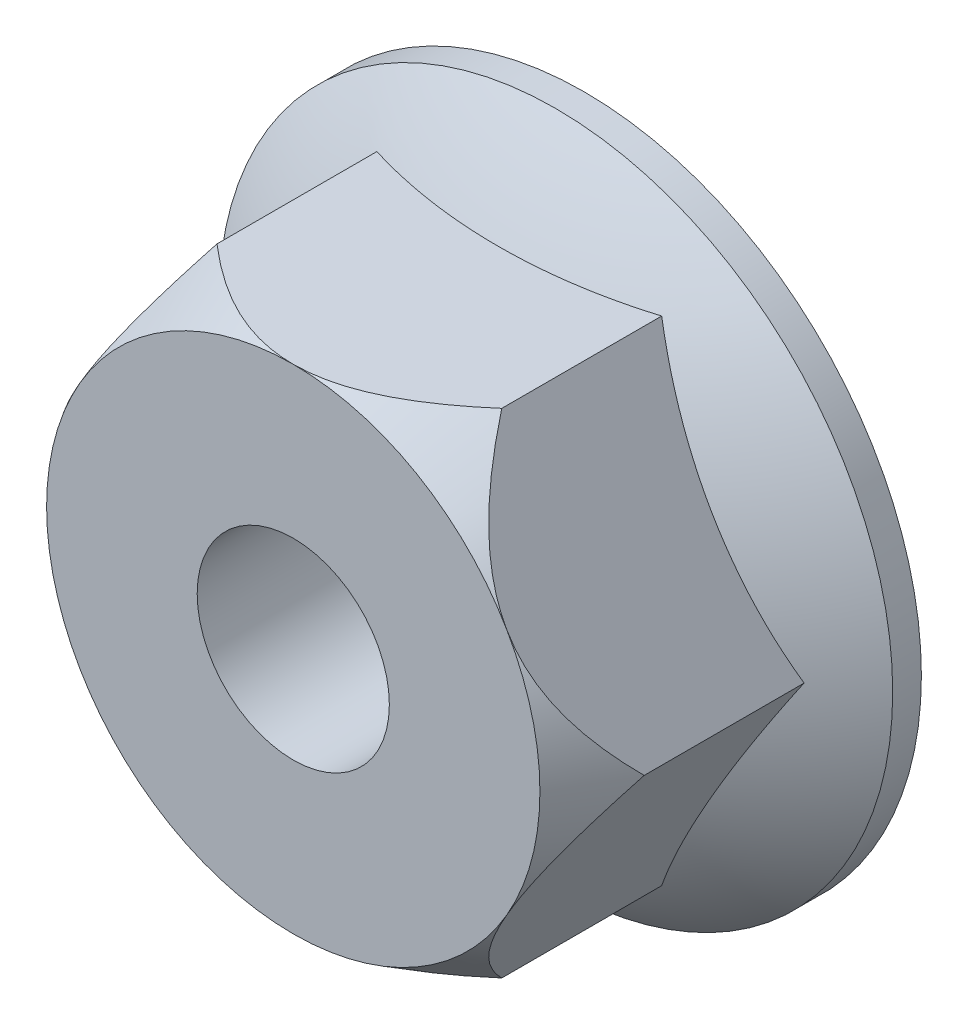
ISO-10303-21;
HEADER;
FILE_DESCRIPTION(('STEP AP214'),'2;1');
FILE_NAME('part.step','',(''),(''),'','','');
FILE_SCHEMA(('AUTOMOTIVE_DESIGN { 1 0 10303 214 1 1 1 1 }'));
ENDSEC;
DATA;
#1=APPLICATION_CONTEXT('core data for automotive mechanical design processes');
#2=APPLICATION_PROTOCOL_DEFINITION('international standard','automotive_design',2000,#1);
#3=PRODUCT_CONTEXT('',#1,'mechanical');
#4=PRODUCT('Part','Part','',(#3));
#5=PRODUCT_RELATED_PRODUCT_CATEGORY('part','',(#4));
#6=PRODUCT_DEFINITION_FORMATION('','',#4);
#7=PRODUCT_DEFINITION_CONTEXT('part definition',#1,'design');
#8=PRODUCT_DEFINITION('design','',#6,#7);
#9=PRODUCT_DEFINITION_SHAPE('','',#8);
#10=(LENGTH_UNIT() NAMED_UNIT(*) SI_UNIT(.MILLI.,.METRE.));
#11=(NAMED_UNIT(*) PLANE_ANGLE_UNIT() SI_UNIT($,.RADIAN.));
#12=(NAMED_UNIT(*) SI_UNIT($,.STERADIAN.) SOLID_ANGLE_UNIT());
#13=UNCERTAINTY_MEASURE_WITH_UNIT(LENGTH_MEASURE(1.E-05),#10,'distance_accuracy_value','');
#14=(GEOMETRIC_REPRESENTATION_CONTEXT(3) GLOBAL_UNCERTAINTY_ASSIGNED_CONTEXT((#13)) GLOBAL_UNIT_ASSIGNED_CONTEXT((#10,
#11,#12)) REPRESENTATION_CONTEXT('',''));
#15=CARTESIAN_POINT('',(0.,0.,0.));
#16=DIRECTION('',(0.,0.,1.));
#17=DIRECTION('',(1.,0.,0.));
#18=AXIS2_PLACEMENT_3D('',#15,#16,#17);
#19=CARTESIAN_POINT('',(2.52232785603564,-4.3688,2.5781));
#20=DIRECTION('',(-0.866025403784439,0.5,0.));
#21=DIRECTION('',(-0.5,-0.866025403784439,0.));
#22=AXIS2_PLACEMENT_3D('',#19,#20,#21);
#23=PLANE('',#22);
#24=DIRECTION('',(0.,0.,-1.));
#25=VECTOR('',#24,1.);
#26=CARTESIAN_POINT('',(5.04465571207128,0.,2.5781));
#27=LINE('',#26,#25);
#28=CARTESIAN_POINT('',(5.04465571207128,0.,1.40748356810692));
#29=VERTEX_POINT('',#28);
#30=CARTESIAN_POINT('',(5.04465571207128,0.,-1.42519994289287));
#31=VERTEX_POINT('',#30);
#32=EDGE_CURVE('E151',#29,#31,#27,.T.);
#33=ORIENTED_EDGE('',*,*,#32,.F.);
#34=CARTESIAN_POINT('',(5.04477118212511,0.000200000000000434,1.40728356124021));
#35=CARTESIAN_POINT('',(5.01838972076335,-0.0454940314564892,1.45297604754845));
#36=CARTESIAN_POINT('',(4.9917450272152,-0.091643994433979,1.49805914697145));
#37=CARTESIAN_POINT('',(4.9378712358627,-0.184956138252875,1.58683669576798));
#38=CARTESIAN_POINT('',(4.91064197353906,-0.232118604050044,1.6305307453956));
#39=CARTESIAN_POINT('',(4.82773264618601,-0.375721771446888,1.75967262761203));
#40=CARTESIAN_POINT('',(4.77109874171729,-0.473814571417709,1.84271089701846));
#41=CARTESIAN_POINT('',(4.65342216765148,-0.677636376560339,2.00232696523342));
#42=CARTESIAN_POINT('',(4.59230339490709,-0.783497196249886,2.07868241350526));
#43=CARTESIAN_POINT('',(4.46675490166529,-1.00095356535839,2.21922394949972));
#44=CARTESIAN_POINT('',(4.40233291331941,-1.11253572229808,2.28343694302576));
#45=CARTESIAN_POINT('',(4.30022820025778,-1.28938627301305,2.37019802539592));
#46=CARTESIAN_POINT('',(4.26374074307293,-1.35258440269621,2.39839695808273));
#47=CARTESIAN_POINT('',(4.18981014820154,-1.48063594924724,2.44932928619382));
#48=CARTESIAN_POINT('',(4.152366939196,-1.54548948964327,2.47206227241787));
#49=CARTESIAN_POINT('',(4.07697163232281,-1.67607799179987,2.51119368264708));
#50=CARTESIAN_POINT('',(4.03902590946211,-1.74180191172453,2.52764082835491));
#51=CARTESIAN_POINT('',(3.96256334543083,-1.8742389575037,2.55385948557379));
#52=CARTESIAN_POINT('',(3.92404661249412,-1.94095189589164,2.56363224608191));
#53=CARTESIAN_POINT('',(3.84636795706199,-2.07549527376372,2.57616954954692));
#54=CARTESIAN_POINT('',(3.80720335993493,-2.14333034584577,2.57886867141013));
#55=CARTESIAN_POINT('',(3.72892021125114,-2.27892073674255,2.57695376960975));
#56=CARTESIAN_POINT('',(3.68980165953607,-2.34667605583157,2.57233977116996));
#57=CARTESIAN_POINT('',(3.61185535922068,-2.48168300823985,2.55597591639989));
#58=CARTESIAN_POINT('',(3.57302842914929,-2.54893322382541,2.54421054632744));
#59=CARTESIAN_POINT('',(3.49602025149047,-2.68231530012878,2.5140088797392));
#60=CARTESIAN_POINT('',(3.45783940716822,-2.7484464623708,2.49556856684735));
#61=CARTESIAN_POINT('',(3.32283408069614,-2.98228254711287,2.41879359988523));
#62=CARTESIAN_POINT('',(3.22836553398302,-3.14590686973719,2.34337101714502));
#63=CARTESIAN_POINT('',(3.09193648217781,-3.38220891909225,2.20940426479207));
#64=CARTESIAN_POINT('',(3.0472273195155,-3.45964746038723,2.16112018073346));
#65=CARTESIAN_POINT('',(2.95945950810159,-3.61166576902525,2.05884869082361));
#66=CARTESIAN_POINT('',(2.91640058938149,-3.68624600396744,2.00486222331745));
#67=CARTESIAN_POINT('',(2.81212553308769,-3.8668556994304,1.86604731677575));
#68=CARTESIAN_POINT('',(2.75179688752463,-3.97134797869744,1.77856845662019));
#69=CARTESIAN_POINT('',(2.66379192808805,-4.12377703975964,1.64238555196898));
#70=CARTESIAN_POINT('',(2.63502740004978,-4.17359866377766,1.59643739233095));
#71=CARTESIAN_POINT('',(2.57814871259972,-4.27211544030899,1.50298003023234));
#72=CARTESIAN_POINT('',(2.550034419995,-4.32081082351923,1.45547115237946));
#73=CARTESIAN_POINT('',(2.5222123859818,-4.369,1.40728356124021));
#74=B_SPLINE_CURVE_WITH_KNOTS('',3,(#34,#35,#36,#37,#38,#39,#40,#41,#42,#43,#44,#45,#46,#47,#48,
#49,#50,#51,#52,#53,#54,#55,#56,#57,#58,#59,#60,#61,#62,#63,#64,#65,#66,#67,#68,#69,#70,#71,#72,
#73),.UNSPECIFIED.,.F.,.F.,(4,2,2,2,2,2,2,2,2,2,2,2,2,2,2,2,2,2,2,4),(0.,0.209383843782731,
0.418827409151647,0.839847625526273,1.27174570653059,1.70267525648481,1.9371989555356,
2.17174020640292,2.40442475702584,2.6370657527735,2.8718508752133,3.10663518785405,
3.34193065388378,3.57736793540426,4.183646853158,4.48841110728903,4.79312528940447,
5.2398120567083,5.46067115270504,5.68148460033933),.UNSPECIFIED.);
#75=CARTESIAN_POINT('',(3.78349178405346,-2.1844,2.5781));
#76=VERTEX_POINT('',#75);
#77=EDGE_CURVE('E132',#29,#76,#74,.T.);
#78=ORIENTED_EDGE('',*,*,#77,.T.);
#79=CARTESIAN_POINT('',(2.52232785603564,-4.3688,1.40748356810692));
#80=VERTEX_POINT('',#79);
#81=EDGE_CURVE('E121',#76,#80,#74,.T.);
#82=ORIENTED_EDGE('',*,*,#81,.T.);
#83=DIRECTION('',(0.,0.,-1.));
#84=VECTOR('',#83,1.);
#85=CARTESIAN_POINT('',(2.52232785603564,-4.3688,2.5781));
#86=LINE('',#85,#84);
#87=CARTESIAN_POINT('',(2.52232785603564,-4.3688,-1.42519994289287));
#88=VERTEX_POINT('',#87);
#89=EDGE_CURVE('E438',#80,#88,#86,.T.);
#90=ORIENTED_EDGE('',*,*,#89,.T.);
#91=CARTESIAN_POINT('',(3.78349178405346,-2.1844,-9.64066349693251));
#92=DIRECTION('',(-0.866025403784439,0.5,0.));
#93=DIRECTION('',(-0.5,-0.866025403784439,0.));
#94=AXIS2_PLACEMENT_3D('',#91,#92,#93);
#95=CIRCLE('',#94,8.59395015235061);
#96=EDGE_CURVE('E453',#31,#88,#95,.F.);
#97=ORIENTED_EDGE('',*,*,#96,.F.);
#98=EDGE_LOOP('',(#33,#78,#82,#90,#97));
#99=FACE_BOUND('',#98,.T.);
#100=ADVANCED_FACE('F49',(#99),#23,.F.);
#101=CARTESIAN_POINT('',(5.04465571207128,0.,2.5781));
#102=DIRECTION('',(-0.866025403784438,-0.5,0.));
#103=DIRECTION('',(0.5,-0.866025403784439,0.));
#104=AXIS2_PLACEMENT_3D('',#101,#102,#103);
#105=PLANE('',#104);
#106=DIRECTION('',(0.,0.,-1.));
#107=VECTOR('',#106,1.);
#108=CARTESIAN_POINT('',(2.52232785603564,4.3688,2.5781));
#109=LINE('',#108,#107);
#110=CARTESIAN_POINT('',(2.52232785603564,4.3688,1.40748356810692));
#111=VERTEX_POINT('',#110);
#112=CARTESIAN_POINT('',(2.52232785603564,4.3688,-1.42519994289287));
#113=VERTEX_POINT('',#112);
#114=EDGE_CURVE('E436',#111,#113,#109,.T.);
#115=ORIENTED_EDGE('',*,*,#114,.F.);
#116=CARTESIAN_POINT('',(2.5222123859818,4.369,1.40728356124021));
#117=CARTESIAN_POINT('',(2.54859384734356,4.32330596854351,1.45297604754845));
#118=CARTESIAN_POINT('',(2.57523854089171,4.27715600556602,1.49805914697145));
#119=CARTESIAN_POINT('',(2.62911233224421,4.18384386174713,1.58683669576798));
#120=CARTESIAN_POINT('',(2.65634159456785,4.13668139594996,1.6305307453956));
#121=CARTESIAN_POINT('',(2.7392509219209,3.99307822855311,1.75967262761203));
#122=CARTESIAN_POINT('',(2.79588482638962,3.89498542858229,1.84271089701846));
#123=CARTESIAN_POINT('',(2.91356140045543,3.69116362343966,2.00232696523342));
#124=CARTESIAN_POINT('',(2.97468017319982,3.58530280375011,2.07868241350526));
#125=CARTESIAN_POINT('',(3.10022866644162,3.36784643464161,2.21922394949972));
#126=CARTESIAN_POINT('',(3.16465065478751,3.25626427770192,2.28343694302576));
#127=CARTESIAN_POINT('',(3.26675536784913,3.07941372698695,2.37019802539592));
#128=CARTESIAN_POINT('',(3.30324282503398,3.01621559730379,2.39839695808273));
#129=CARTESIAN_POINT('',(3.37717341990537,2.88816405075276,2.44932928619382));
#130=CARTESIAN_POINT('',(3.41461662891091,2.82331051035673,2.47206227241787));
#131=CARTESIAN_POINT('',(3.4900119357841,2.69272200820013,2.51119368264708));
#132=CARTESIAN_POINT('',(3.5279576586448,2.62699808827547,2.52764082835491));
#133=CARTESIAN_POINT('',(3.60442022267608,2.49456104249631,2.55385948557379));
#134=CARTESIAN_POINT('',(3.64293695561279,2.42784810410836,2.56363224608191));
#135=CARTESIAN_POINT('',(3.72061561104492,2.29330472623628,2.57616954954692));
#136=CARTESIAN_POINT('',(3.75978020817198,2.22546965415423,2.57886867141013));
#137=CARTESIAN_POINT('',(3.83806335685577,2.08987926325745,2.57695376960975));
#138=CARTESIAN_POINT('',(3.87718190857084,2.02212394416844,2.57233977116996));
#139=CARTESIAN_POINT('',(3.95512820888624,1.88711699176015,2.55597591639989));
#140=CARTESIAN_POINT('',(3.99395513895762,1.81986677617459,2.54421054632744));
#141=CARTESIAN_POINT('',(4.07096331661644,1.68648469987123,2.5140088797392));
#142=CARTESIAN_POINT('',(4.10914416093869,1.6203535376292,2.49556856684735));
#143=CARTESIAN_POINT('',(4.24414948741078,1.38651745288713,2.41879359988523));
#144=CARTESIAN_POINT('',(4.3386180341239,1.22289313026281,2.34337101714502));
#145=CARTESIAN_POINT('',(4.4750470859291,0.986591080907749,2.20940426479207));
#146=CARTESIAN_POINT('',(4.51975624859141,0.909152539612769,2.16112018073346));
#147=CARTESIAN_POINT('',(4.60752406000532,0.757134230974755,2.05884869082361));
#148=CARTESIAN_POINT('',(4.65058297872542,0.682553996032561,2.00486222331745));
#149=CARTESIAN_POINT('',(4.75485803501922,0.501944300569603,1.86604731677575));
#150=CARTESIAN_POINT('',(4.81518668058228,0.397452021302562,1.77856845662019));
#151=CARTESIAN_POINT('',(4.90319164001886,0.245022960240365,1.64238555196898));
#152=CARTESIAN_POINT('',(4.93195616805713,0.195201336222338,1.59643739233095));
#153=CARTESIAN_POINT('',(4.98883485550719,0.0966845596910154,1.50298003023234));
#154=CARTESIAN_POINT('',(5.01694914811192,0.0479891764807695,1.45547115237945));
#155=CARTESIAN_POINT('',(5.04477118212511,-0.000199999999999951,1.40728356124021));
#156=B_SPLINE_CURVE_WITH_KNOTS('',3,(#116,#117,#118,#119,#120,#121,#122,#123,#124,#125,#126,
#127,#128,#129,#130,#131,#132,#133,#134,#135,#136,#137,#138,#139,#140,#141,#142,#143,#144,#145,
#146,#147,#148,#149,#150,#151,#152,#153,#154,#155),.UNSPECIFIED.,.F.,.F.,(4,2,2,2,2,2,2,2,2,2,2,
2,2,2,2,2,2,2,2,4),(0.,0.209383843782731,0.418827409151647,0.839847625526273,1.27174570653059,
1.70267525648481,1.9371989555356,2.17174020640292,2.40442475702584,2.6370657527735,
2.8718508752133,3.10663518785405,3.34193065388378,3.57736793540426,4.183646853158,
4.48841110728903,4.79312528940447,5.2398120567083,5.46067115270504,5.68148460033933),.UNSPECIFIED.);
#157=CARTESIAN_POINT('',(3.78349178405346,2.1844,2.5781));
#158=VERTEX_POINT('',#157);
#159=EDGE_CURVE('E204',#111,#158,#156,.T.);
#160=ORIENTED_EDGE('',*,*,#159,.T.);
#161=EDGE_CURVE('E140',#158,#29,#156,.T.);
#162=ORIENTED_EDGE('',*,*,#161,.T.);
#163=ORIENTED_EDGE('',*,*,#32,.T.);
#164=CARTESIAN_POINT('',(3.78349178405346,2.1844,-9.64066349693251));
#165=DIRECTION('',(-0.866025403784438,-0.5,0.));
#166=DIRECTION('',(0.5,-0.866025403784439,0.));
#167=AXIS2_PLACEMENT_3D('',#164,#165,#166);
#168=CIRCLE('',#167,8.59395015235061);
#169=EDGE_CURVE('E467',#113,#31,#168,.F.);
#170=ORIENTED_EDGE('',*,*,#169,.F.);
#171=EDGE_LOOP('',(#115,#160,#162,#163,#170));
#172=FACE_BOUND('',#171,.T.);
#173=ADVANCED_FACE('F212',(#172),#105,.F.);
#174=CARTESIAN_POINT('',(2.52232785603564,4.3688,2.5781));
#175=DIRECTION('',(0.,-1.,0.));
#176=DIRECTION('',(0.,0.,-1.));
#177=AXIS2_PLACEMENT_3D('',#174,#175,#176);
#178=PLANE('',#177);
#179=DIRECTION('',(0.,0.,-1.));
#180=VECTOR('',#179,1.);
#181=CARTESIAN_POINT('',(-2.52232785603564,4.3688,2.5781));
#182=LINE('',#181,#180);
#183=CARTESIAN_POINT('',(-2.52232785603564,4.3688,1.40748356810692));
#184=VERTEX_POINT('',#183);
#185=CARTESIAN_POINT('',(-2.52232785603564,4.3688,-1.42519994289287));
#186=VERTEX_POINT('',#185);
#187=EDGE_CURVE('E410',#184,#186,#182,.T.);
#188=ORIENTED_EDGE('',*,*,#187,.F.);
#189=CARTESIAN_POINT('',(-6.79494610127638,4.3688,-3.84681115268596));
#190=CARTESIAN_POINT('',(-6.67178960638543,4.3688,-3.66740387224179));
#191=CARTESIAN_POINT('',(-6.54798373573214,4.3688,-3.48843893868895));
#192=CARTESIAN_POINT('',(-6.29881887933844,4.3688,-3.13157737899841));
#193=CARTESIAN_POINT('',(-6.17345979666618,4.3688,-2.9536808205743));
#194=CARTESIAN_POINT('',(-5.92064307765416,4.3688,-2.59873191305055));
#195=CARTESIAN_POINT('',(-5.79318108603631,4.3688,-2.42168266128306));
#196=CARTESIAN_POINT('',(-5.53613555925301,4.3688,-2.06913501388844));
#197=CARTESIAN_POINT('',(-5.40655207154713,4.3688,-1.89363658370306));
#198=CARTESIAN_POINT('',(-5.13654522223353,4.3688,-1.53343844710915));
#199=CARTESIAN_POINT('',(-4.99595625016081,4.3688,-1.34886259881722));
#200=CARTESIAN_POINT('',(-4.71130315156418,4.3688,-0.982411787256466));
#201=CARTESIAN_POINT('',(-4.56723913528422,4.3688,-0.800536738601175));
#202=CARTESIAN_POINT('',(-4.27497315076414,4.3688,-0.440462271994804));
#203=CARTESIAN_POINT('',(-4.12677591482846,4.3688,-0.262259026331427));
#204=CARTESIAN_POINT('',(-3.8250178903273,4.3688,0.0895320518202946));
#205=CARTESIAN_POINT('',(-3.67145787163863,4.3688,0.263120540548997));
#206=CARTESIAN_POINT('',(-3.35950142913357,4.3688,0.601802177022657));
#207=CARTESIAN_POINT('',(-3.20119317156389,4.3688,0.766976129320459));
#208=CARTESIAN_POINT('',(-2.87571765565725,4.3688,1.08888884410601));
#209=CARTESIAN_POINT('',(-2.7085405761754,4.3688,1.24561785084403));
#210=CARTESIAN_POINT('',(-2.45050288771095,4.3688,1.46994762000494));
#211=CARTESIAN_POINT('',(-2.36391173756921,4.3688,1.54245744895338));
#212=CARTESIAN_POINT('',(-2.18759651521151,4.3688,1.68354714058523));
#213=CARTESIAN_POINT('',(-2.09787315540055,4.3688,1.75212788766611));
#214=CARTESIAN_POINT('',(-1.91505055029231,4.3688,1.88428197960861));
#215=CARTESIAN_POINT('',(-1.82195807706779,4.3688,1.94786463435025));
#216=CARTESIAN_POINT('',(-1.63188871345084,4.3688,2.06888447623615));
#217=CARTESIAN_POINT('',(-1.53491387564159,4.3688,2.12632485330402));
#218=CARTESIAN_POINT('',(-1.35974673372052,4.3688,2.22104809994811));
#219=CARTESIAN_POINT('',(-1.28241732713144,4.3688,2.25991562440184));
#220=CARTESIAN_POINT('',(-1.12527510138325,4.3688,2.33222903260985));
#221=CARTESIAN_POINT('',(-1.04546213265367,4.3688,2.36567458907444));
#222=CARTESIAN_POINT('',(-0.802713464736429,4.3688,2.45626559815334));
#223=CARTESIAN_POINT('',(-0.635983157648204,4.3688,2.50393959155582));
#224=CARTESIAN_POINT('',(-0.322642603096501,4.3688,2.56151778337263));
#225=CARTESIAN_POINT('',(-0.176907786628058,4.3688,2.57612242014737));
#226=CARTESIAN_POINT('',(0.114952951380527,4.3688,2.57969714093696));
#227=CARTESIAN_POINT('',(0.261078961305072,4.3688,2.56866083822949));
#228=CARTESIAN_POINT('',(0.54863170191162,4.3688,2.52269528396688));
#229=CARTESIAN_POINT('',(0.690077833005693,4.3688,2.48788251057058));
#230=CARTESIAN_POINT('',(0.966538878207207,4.3688,2.39871043350873));
#231=CARTESIAN_POINT('',(1.10155083800934,4.3688,2.34434224689324));
#232=CARTESIAN_POINT('',(1.35944610394514,4.3688,2.22302562378074));
#233=CARTESIAN_POINT('',(1.48259464616061,4.3688,2.1566276875588));
#234=CARTESIAN_POINT('',(1.72272476024541,4.3688,2.01339122933715));
#235=CARTESIAN_POINT('',(1.83970036089685,4.3688,1.93654284636134));
#236=CARTESIAN_POINT('',(2.0693462054086,4.3688,1.77415227437362));
#237=CARTESIAN_POINT('',(2.18195439573345,4.3688,1.6885232030237));
#238=CARTESIAN_POINT('',(2.34715319692676,4.3688,1.55558264262786));
#239=CARTESIAN_POINT('',(2.40158886445193,4.3688,1.51053014197804));
#240=CARTESIAN_POINT('',(2.50933167578224,4.3688,1.4190960195571));
#241=CARTESIAN_POINT('',(2.56263884066725,4.3688,1.37271442265099));
#242=CARTESIAN_POINT('',(2.72397889117637,4.3688,1.22917889589059));
#243=CARTESIAN_POINT('',(2.83034115104318,4.3688,1.13014442199925));
#244=CARTESIAN_POINT('',(3.03937777185917,4.3688,0.928243810916305));
#245=CARTESIAN_POINT('',(3.1420513703567,4.3688,0.82537689040188));
#246=CARTESIAN_POINT('',(3.34433308543858,4.3688,0.616540693375229));
#247=CARTESIAN_POINT('',(3.44393900602537,4.3688,0.510569295756719));
#248=CARTESIAN_POINT('',(3.64047872859589,4.3688,0.296171930248619));
#249=CARTESIAN_POINT('',(3.73741233456277,4.3688,0.187745783357558));
#250=CARTESIAN_POINT('',(4.025512129414,4.3688,-0.141340152585415));
#251=CARTESIAN_POINT('',(4.21322806223601,4.3688,-0.365020354732293));
#252=CARTESIAN_POINT('',(4.58181743591417,4.3688,-0.817945426324633));
#253=CARTESIAN_POINT('',(4.76268996549047,4.3688,-1.04719103024313));
#254=CARTESIAN_POINT('',(5.10279237884403,4.3688,-1.48850048264436));
#255=CARTESIAN_POINT('',(5.26248455880906,4.3688,-1.70020918641395));
#256=CARTESIAN_POINT('',(5.57839441344209,4.3688,-2.12623479747001));
#257=CARTESIAN_POINT('',(5.73461168197642,4.3688,-2.34055200514596));
#258=CARTESIAN_POINT('',(6.04282993649794,4.3688,-2.76930750327401));
#259=CARTESIAN_POINT('',(6.19485606554616,4.3688,-2.98372776161847));
#260=CARTESIAN_POINT('',(6.49654800001157,4.3688,-3.41415809253691));
#261=CARTESIAN_POINT('',(6.64621428323524,4.3688,-3.63016782994773));
#262=CARTESIAN_POINT('',(6.79494610127639,4.3688,-3.84681115268596));
#263=B_SPLINE_CURVE_WITH_KNOTS('',3,(#189,#190,#191,#192,#193,#194,#195,#196,#197,#198,#199,
#200,#201,#202,#203,#204,#205,#206,#207,#208,#209,#210,#211,#212,#213,#214,#215,#216,#217,#218,
#219,#220,#221,#222,#223,#224,#225,#226,#227,#228,#229,#230,#231,#232,#233,#234,#235,#236,#237,
#238,#239,#240,#241,#242,#243,#244,#245,#246,#247,#248,#249,#250,#251,#252,#253,#254,#255,#256,
#257,#258,#259,#260,#261,#262),.UNSPECIFIED.,.F.,.F.,(4,2,2,2,2,2,2,2,2,2,2,2,2,2,2,2,2,2,2,2,2,
2,2,2,2,2,2,2,2,2,2,2,2,2,2,2,4),(0.,0.652835413369053,1.30571177575939,1.96017288578287,
2.61461937493494,3.310647488194,4.0066535492937,4.70189302889729,5.39703310747974,
6.0831882917098,6.77011984974441,7.10885666393502,7.4475169298126,7.78553064495189,
8.12336795503148,8.38281577666787,8.64227925369119,9.15955081545701,9.59683665378223,
10.0342314242562,10.469498674613,10.9049638931864,11.3240394421813,11.7435132081743,
12.1676341054576,12.3796003603866,12.5915626523918,13.0274166335979,13.4633601940946,
13.8996088947299,14.3358895099448,15.2117078287966,16.0876423656423,16.8831477533991,
17.6787456332281,18.4672670584038,19.2556267237845),.UNSPECIFIED.);
#264=CARTESIAN_POINT('',(0.,4.3688,2.5781));
#265=VERTEX_POINT('',#264);
#266=EDGE_CURVE('E407',#184,#265,#263,.T.);
#267=ORIENTED_EDGE('',*,*,#266,.T.);
#268=EDGE_CURVE('E205',#265,#111,#263,.T.);
#269=ORIENTED_EDGE('',*,*,#268,.T.);
#270=ORIENTED_EDGE('',*,*,#114,.T.);
#271=CARTESIAN_POINT('',(0.,4.3688,-9.64066349693251));
#272=DIRECTION('',(0.,-1.,0.));
#273=DIRECTION('',(0.,0.,-1.));
#274=AXIS2_PLACEMENT_3D('',#271,#272,#273);
#275=CIRCLE('',#274,8.59395015235061);
#276=EDGE_CURVE('E459',#186,#113,#275,.F.);
#277=ORIENTED_EDGE('',*,*,#276,.F.);
#278=EDGE_LOOP('',(#188,#267,#269,#270,#277));
#279=FACE_BOUND('',#278,.T.);
#280=ADVANCED_FACE('F215',(#279),#178,.F.);
#281=CARTESIAN_POINT('',(-2.52232785603564,4.3688,2.5781));
#282=DIRECTION('',(0.866025403784438,-0.5,0.));
#283=DIRECTION('',(0.5,0.866025403784439,0.));
#284=AXIS2_PLACEMENT_3D('',#281,#282,#283);
#285=PLANE('',#284);
#286=DIRECTION('',(0.,0.,-1.));
#287=VECTOR('',#286,1.);
#288=CARTESIAN_POINT('',(-5.04465571207128,0.,2.5781));
#289=LINE('',#288,#287);
#290=CARTESIAN_POINT('',(-5.04465571207128,0.,1.40748356810692));
#291=VERTEX_POINT('',#290);
#292=CARTESIAN_POINT('',(-5.04465571207128,0.,-1.42519994289287));
#293=VERTEX_POINT('',#292);
#294=EDGE_CURVE('E427',#291,#293,#289,.T.);
#295=ORIENTED_EDGE('',*,*,#294,.F.);
#296=CARTESIAN_POINT('',(-5.04477118212511,-0.000199999999998265,1.40728356124021));
#297=CARTESIAN_POINT('',(-5.01838972076335,0.0454940314564914,1.45297604754845));
#298=CARTESIAN_POINT('',(-4.99174502721521,0.0916439944339811,1.49805914697145));
#299=CARTESIAN_POINT('',(-4.9378712358627,0.184956138252877,1.58683669576798));
#300=CARTESIAN_POINT('',(-4.91064197353906,0.232118604050046,1.6305307453956));
#301=CARTESIAN_POINT('',(-4.82773264618601,0.37572177144689,1.75967262761203));
#302=CARTESIAN_POINT('',(-4.77109874171729,0.473814571417712,1.84271089701846));
#303=CARTESIAN_POINT('',(-4.65342216765148,0.677636376560341,2.00232696523342));
#304=CARTESIAN_POINT('',(-4.59230339490709,0.783497196249888,2.07868241350526));
#305=CARTESIAN_POINT('',(-4.46675490166529,1.00095356535839,2.21922394949972));
#306=CARTESIAN_POINT('',(-4.40233291331941,1.11253572229808,2.28343694302576));
#307=CARTESIAN_POINT('',(-4.30022820025779,1.28938627301305,2.37019802539592));
#308=CARTESIAN_POINT('',(-4.26374074307293,1.35258440269621,2.39839695808273));
#309=CARTESIAN_POINT('',(-4.18981014820154,1.48063594924725,2.44932928619381));
#310=CARTESIAN_POINT('',(-4.152366939196,1.54548948964327,2.47206227241787));
#311=CARTESIAN_POINT('',(-4.07697163232281,1.67607799179988,2.51119368264708));
#312=CARTESIAN_POINT('',(-4.03902590946211,1.74180191172453,2.52764082835491));
#313=CARTESIAN_POINT('',(-3.96256334543083,1.8742389575037,2.55385948557378));
#314=CARTESIAN_POINT('',(-3.92404661249412,1.94095189589164,2.56363224608191));
#315=CARTESIAN_POINT('',(-3.84636795706199,2.07549527376373,2.57616954954692));
#316=CARTESIAN_POINT('',(-3.80720335993493,2.14333034584577,2.57886867141012));
#317=CARTESIAN_POINT('',(-3.72892021125114,2.27892073674256,2.57695376960974));
#318=CARTESIAN_POINT('',(-3.68980165953607,2.34667605583157,2.57233977116995));
#319=CARTESIAN_POINT('',(-3.61185535922068,2.48168300823986,2.55597591639989));
#320=CARTESIAN_POINT('',(-3.57302842914929,2.54893322382541,2.54421054632744));
#321=CARTESIAN_POINT('',(-3.49602025149047,2.68231530012878,2.5140088797392));
#322=CARTESIAN_POINT('',(-3.45783940716822,2.7484464623708,2.49556856684735));
#323=CARTESIAN_POINT('',(-3.32283408069614,2.98228254711287,2.41879359988523));
#324=CARTESIAN_POINT('',(-3.22836553398302,3.14590686973719,2.34337101714502));
#325=CARTESIAN_POINT('',(-3.09193648217781,3.38220891909226,2.20940426479207));
#326=CARTESIAN_POINT('',(-3.0472273195155,3.45964746038724,2.16112018073346));
#327=CARTESIAN_POINT('',(-2.95945950810159,3.61166576902525,2.05884869082361));
#328=CARTESIAN_POINT('',(-2.91640058938149,3.68624600396744,2.00486222331745));
#329=CARTESIAN_POINT('',(-2.81212553308769,3.8668556994304,1.86604731677575));
#330=CARTESIAN_POINT('',(-2.75179688752463,3.97134797869744,1.77856845662019));
#331=CARTESIAN_POINT('',(-2.66379192808805,4.12377703975964,1.64238555196897));
#332=CARTESIAN_POINT('',(-2.63502740004978,4.17359866377766,1.59643739233095));
#333=CARTESIAN_POINT('',(-2.57814871259973,4.27211544030899,1.50298003023234));
#334=CARTESIAN_POINT('',(-2.550034419995,4.32081082351923,1.45547115237945));
#335=CARTESIAN_POINT('',(-2.5222123859818,4.369,1.40728356124021));
#336=B_SPLINE_CURVE_WITH_KNOTS('',3,(#296,#297,#298,#299,#300,#301,#302,#303,#304,#305,#306,
#307,#308,#309,#310,#311,#312,#313,#314,#315,#316,#317,#318,#319,#320,#321,#322,#323,#324,#325,
#326,#327,#328,#329,#330,#331,#332,#333,#334,#335),.UNSPECIFIED.,.F.,.F.,(4,2,2,2,2,2,2,2,2,2,2,
2,2,2,2,2,2,2,2,4),(0.,0.209383843782731,0.418827409151647,0.839847625526273,1.27174570653059,
1.70267525648481,1.9371989555356,2.17174020640292,2.40442475702584,2.6370657527735,
2.8718508752133,3.10663518785405,3.34193065388379,3.57736793540426,4.183646853158,
4.48841110728904,4.79312528940447,5.2398120567083,5.46067115270504,5.68148460033932),.UNSPECIFIED.);
#337=CARTESIAN_POINT('',(-3.78349178405346,2.1844,2.5781));
#338=VERTEX_POINT('',#337);
#339=EDGE_CURVE('E155',#291,#338,#336,.T.);
#340=ORIENTED_EDGE('',*,*,#339,.T.);
#341=EDGE_CURVE('E419',#338,#184,#336,.T.);
#342=ORIENTED_EDGE('',*,*,#341,.T.);
#343=ORIENTED_EDGE('',*,*,#187,.T.);
#344=CARTESIAN_POINT('',(-3.78349178405346,2.1844,-9.64066349693251));
#345=DIRECTION('',(0.866025403784438,-0.5,0.));
#346=DIRECTION('',(0.5,0.866025403784439,0.));
#347=AXIS2_PLACEMENT_3D('',#344,#345,#346);
#348=CIRCLE('',#347,8.59395015235061);
#349=EDGE_CURVE('E429',#293,#186,#348,.F.);
#350=ORIENTED_EDGE('',*,*,#349,.F.);
#351=EDGE_LOOP('',(#295,#340,#342,#343,#350));
#352=FACE_BOUND('',#351,.T.);
#353=ADVANCED_FACE('F219',(#352),#285,.F.);
#354=CARTESIAN_POINT('',(-5.04465571207128,0.,2.5781));
#355=DIRECTION('',(0.866025403784439,0.5,0.));
#356=DIRECTION('',(-0.5,0.866025403784439,0.));
#357=AXIS2_PLACEMENT_3D('',#354,#355,#356);
#358=PLANE('',#357);
#359=DIRECTION('',(0.,0.,-1.));
#360=VECTOR('',#359,1.);
#361=CARTESIAN_POINT('',(-2.52232785603564,-4.3688,2.5781));
#362=LINE('',#361,#360);
#363=CARTESIAN_POINT('',(-2.52232785603564,-4.3688,1.40748356810693));
#364=VERTEX_POINT('',#363);
#365=CARTESIAN_POINT('',(-2.52232785603564,-4.3688,-1.42519994289287));
#366=VERTEX_POINT('',#365);
#367=EDGE_CURVE('E396',#364,#366,#362,.T.);
#368=ORIENTED_EDGE('',*,*,#367,.F.);
#369=CARTESIAN_POINT('',(-2.5222123859818,-4.369,1.40728356124021));
#370=CARTESIAN_POINT('',(-2.54859384734356,-4.32330596854351,1.45297604754845));
#371=CARTESIAN_POINT('',(-2.57523854089171,-4.27715600556602,1.49805914697145));
#372=CARTESIAN_POINT('',(-2.62911233224421,-4.18384386174713,1.58683669576798));
#373=CARTESIAN_POINT('',(-2.65634159456785,-4.13668139594996,1.6305307453956));
#374=CARTESIAN_POINT('',(-2.7392509219209,-3.99307822855311,1.75967262761203));
#375=CARTESIAN_POINT('',(-2.79588482638962,-3.89498542858229,1.84271089701846));
#376=CARTESIAN_POINT('',(-2.91356140045543,-3.69116362343966,2.00232696523342));
#377=CARTESIAN_POINT('',(-2.97468017319983,-3.58530280375011,2.07868241350526));
#378=CARTESIAN_POINT('',(-3.10022866644162,-3.36784643464161,2.21922394949972));
#379=CARTESIAN_POINT('',(-3.16465065478751,-3.25626427770192,2.28343694302576));
#380=CARTESIAN_POINT('',(-3.26675536784913,-3.07941372698695,2.37019802539592));
#381=CARTESIAN_POINT('',(-3.30324282503398,-3.01621559730379,2.39839695808273));
#382=CARTESIAN_POINT('',(-3.37717341990537,-2.88816405075276,2.44932928619382));
#383=CARTESIAN_POINT('',(-3.41461662891092,-2.82331051035673,2.47206227241787));
#384=CARTESIAN_POINT('',(-3.4900119357841,-2.69272200820013,2.51119368264708));
#385=CARTESIAN_POINT('',(-3.5279576586448,-2.62699808827547,2.52764082835491));
#386=CARTESIAN_POINT('',(-3.60442022267608,-2.4945610424963,2.55385948557379));
#387=CARTESIAN_POINT('',(-3.64293695561279,-2.42784810410836,2.56363224608191));
#388=CARTESIAN_POINT('',(-3.72061561104492,-2.29330472623628,2.57616954954692));
#389=CARTESIAN_POINT('',(-3.75978020817199,-2.22546965415423,2.57886867141013));
#390=CARTESIAN_POINT('',(-3.83806335685577,-2.08987926325745,2.57695376960975));
#391=CARTESIAN_POINT('',(-3.87718190857084,-2.02212394416843,2.57233977116996));
#392=CARTESIAN_POINT('',(-3.95512820888624,-1.88711699176015,2.55597591639989));
#393=CARTESIAN_POINT('',(-3.99395513895762,-1.81986677617459,2.54421054632744));
#394=CARTESIAN_POINT('',(-4.07096331661644,-1.68648469987122,2.5140088797392));
#395=CARTESIAN_POINT('',(-4.10914416093869,-1.6203535376292,2.49556856684735));
#396=CARTESIAN_POINT('',(-4.24414948741078,-1.38651745288713,2.41879359988523));
#397=CARTESIAN_POINT('',(-4.3386180341239,-1.22289313026281,2.34337101714502));
#398=CARTESIAN_POINT('',(-4.4750470859291,-0.986591080907746,2.20940426479207));
#399=CARTESIAN_POINT('',(-4.51975624859141,-0.909152539612766,2.16112018073346));
#400=CARTESIAN_POINT('',(-4.60752406000532,-0.757134230974753,2.05884869082361));
#401=CARTESIAN_POINT('',(-4.65058297872542,-0.682553996032559,2.00486222331745));
#402=CARTESIAN_POINT('',(-4.75485803501922,-0.5019443005696,1.86604731677575));
#403=CARTESIAN_POINT('',(-4.81518668058228,-0.397452021302559,1.77856845662019));
#404=CARTESIAN_POINT('',(-4.90319164001886,-0.245022960240362,1.64238555196898));
#405=CARTESIAN_POINT('',(-4.93195616805713,-0.195201336222336,1.59643739233095));
#406=CARTESIAN_POINT('',(-4.98883485550719,-0.0966845596910135,1.50298003023234));
#407=CARTESIAN_POINT('',(-5.01694914811192,-0.0479891764807678,1.45547115237945));
#408=CARTESIAN_POINT('',(-5.04477118212511,0.000200000000001716,1.40728356124021));
#409=B_SPLINE_CURVE_WITH_KNOTS('',3,(#369,#370,#371,#372,#373,#374,#375,#376,#377,#378,#379,
#380,#381,#382,#383,#384,#385,#386,#387,#388,#389,#390,#391,#392,#393,#394,#395,#396,#397,#398,
#399,#400,#401,#402,#403,#404,#405,#406,#407,#408),.UNSPECIFIED.,.F.,.F.,(4,2,2,2,2,2,2,2,2,2,2,
2,2,2,2,2,2,2,2,4),(0.,0.209383843782731,0.418827409151647,0.839847625526273,1.27174570653059,
1.70267525648481,1.9371989555356,2.17174020640292,2.40442475702584,2.6370657527735,
2.8718508752133,3.10663518785405,3.34193065388379,3.57736793540426,4.183646853158,
4.48841110728904,4.79312528940447,5.2398120567083,5.46067115270505,5.68148460033933),.UNSPECIFIED.);
#410=CARTESIAN_POINT('',(-3.78349178405346,-2.1844,2.5781));
#411=VERTEX_POINT('',#410);
#412=EDGE_CURVE('E133',#364,#411,#409,.T.);
#413=ORIENTED_EDGE('',*,*,#412,.T.);
#414=EDGE_CURVE('E73',#411,#291,#409,.T.);
#415=ORIENTED_EDGE('',*,*,#414,.T.);
#416=ORIENTED_EDGE('',*,*,#294,.T.);
#417=CARTESIAN_POINT('',(-3.78349178405346,-2.1844,-9.64066349693251));
#418=DIRECTION('',(0.866025403784439,0.5,0.));
#419=DIRECTION('',(-0.5,0.866025403784439,0.));
#420=AXIS2_PLACEMENT_3D('',#417,#418,#419);
#421=CIRCLE('',#420,8.59395015235061);
#422=EDGE_CURVE('E452',#366,#293,#421,.F.);
#423=ORIENTED_EDGE('',*,*,#422,.F.);
#424=EDGE_LOOP('',(#368,#413,#415,#416,#423));
#425=FACE_BOUND('',#424,.T.);
#426=ADVANCED_FACE('F223',(#425),#358,.F.);
#427=CARTESIAN_POINT('',(-2.52232785603564,-4.3688,2.5781));
#428=DIRECTION('',(0.,1.,0.));
#429=DIRECTION('',(-1.,0.,0.));
#430=AXIS2_PLACEMENT_3D('',#427,#428,#429);
#431=PLANE('',#430);
#432=ORIENTED_EDGE('',*,*,#89,.F.);
#433=CARTESIAN_POINT('',(6.79494610127638,-4.3688,-3.84681115268596));
#434=CARTESIAN_POINT('',(6.67178960638543,-4.3688,-3.66740387224179));
#435=CARTESIAN_POINT('',(6.54798373573214,-4.3688,-3.48843893868895));
#436=CARTESIAN_POINT('',(6.29881887933844,-4.3688,-3.13157737899841));
#437=CARTESIAN_POINT('',(6.17345979666618,-4.3688,-2.9536808205743));
#438=CARTESIAN_POINT('',(5.92064307765416,-4.3688,-2.59873191305055));
#439=CARTESIAN_POINT('',(5.79318108603631,-4.3688,-2.42168266128306));
#440=CARTESIAN_POINT('',(5.53613555925301,-4.3688,-2.06913501388844));
#441=CARTESIAN_POINT('',(5.40655207154713,-4.3688,-1.89363658370306));
#442=CARTESIAN_POINT('',(5.13654522223353,-4.3688,-1.53343844710915));
#443=CARTESIAN_POINT('',(4.99595625016081,-4.3688,-1.34886259881722));
#444=CARTESIAN_POINT('',(4.71130315156418,-4.3688,-0.982411787256466));
#445=CARTESIAN_POINT('',(4.56723913528422,-4.3688,-0.800536738601175));
#446=CARTESIAN_POINT('',(4.27497315076414,-4.3688,-0.440462271994804));
#447=CARTESIAN_POINT('',(4.12677591482846,-4.3688,-0.262259026331427));
#448=CARTESIAN_POINT('',(3.8250178903273,-4.3688,0.0895320518202944));
#449=CARTESIAN_POINT('',(3.67145787163863,-4.3688,0.263120540548997));
#450=CARTESIAN_POINT('',(3.35950142913358,-4.3688,0.601802177022656));
#451=CARTESIAN_POINT('',(3.20119317156389,-4.3688,0.766976129320458));
#452=CARTESIAN_POINT('',(2.87571765565725,-4.3688,1.08888884410601));
#453=CARTESIAN_POINT('',(2.7085405761754,-4.3688,1.24561785084403));
#454=CARTESIAN_POINT('',(2.45050288771095,-4.3688,1.46994762000494));
#455=CARTESIAN_POINT('',(2.36391173756921,-4.3688,1.54245744895338));
#456=CARTESIAN_POINT('',(2.18759651521151,-4.3688,1.68354714058523));
#457=CARTESIAN_POINT('',(2.09787315540055,-4.3688,1.75212788766611));
#458=CARTESIAN_POINT('',(1.91505055029231,-4.3688,1.88428197960861));
#459=CARTESIAN_POINT('',(1.82195807706779,-4.3688,1.94786463435025));
#460=CARTESIAN_POINT('',(1.63188871345084,-4.3688,2.06888447623615));
#461=CARTESIAN_POINT('',(1.5349138756416,-4.3688,2.12632485330402));
#462=CARTESIAN_POINT('',(1.35974673372053,-4.3688,2.22104809994811));
#463=CARTESIAN_POINT('',(1.28241732713144,-4.3688,2.25991562440184));
#464=CARTESIAN_POINT('',(1.12527510138325,-4.3688,2.33222903260985));
#465=CARTESIAN_POINT('',(1.04546213265367,-4.3688,2.36567458907444));
#466=CARTESIAN_POINT('',(0.80271346473643,-4.3688,2.45626559815334));
#467=CARTESIAN_POINT('',(0.635983157648205,-4.3688,2.50393959155582));
#468=CARTESIAN_POINT('',(0.322642603096503,-4.3688,2.56151778337263));
#469=CARTESIAN_POINT('',(0.176907786628059,-4.3688,2.57612242014737));
#470=CARTESIAN_POINT('',(-0.114952951380525,-4.3688,2.57969714093696));
#471=CARTESIAN_POINT('',(-0.26107896130507,-4.3688,2.56866083822949));
#472=CARTESIAN_POINT('',(-0.548631701911619,-4.3688,2.52269528396688));
#473=CARTESIAN_POINT('',(-0.690077833005691,-4.3688,2.48788251057058));
#474=CARTESIAN_POINT('',(-0.966538878207206,-4.3688,2.39871043350873));
#475=CARTESIAN_POINT('',(-1.10155083800933,-4.3688,2.34434224689324));
#476=CARTESIAN_POINT('',(-1.35944610394513,-4.3688,2.22302562378074));
#477=CARTESIAN_POINT('',(-1.48259464616061,-4.3688,2.1566276875588));
#478=CARTESIAN_POINT('',(-1.72272476024541,-4.3688,2.01339122933715));
#479=CARTESIAN_POINT('',(-1.83970036089685,-4.3688,1.93654284636134));
#480=CARTESIAN_POINT('',(-2.0693462054086,-4.3688,1.77415227437362));
#481=CARTESIAN_POINT('',(-2.18195439573345,-4.3688,1.6885232030237));
#482=CARTESIAN_POINT('',(-2.34715319692675,-4.3688,1.55558264262787));
#483=CARTESIAN_POINT('',(-2.40158886445193,-4.3688,1.51053014197805));
#484=CARTESIAN_POINT('',(-2.50933167578224,-4.3688,1.4190960195571));
#485=CARTESIAN_POINT('',(-2.56263884066724,-4.3688,1.37271442265099));
#486=CARTESIAN_POINT('',(-2.72397889117637,-4.3688,1.2291788958906));
#487=CARTESIAN_POINT('',(-2.83034115104317,-4.3688,1.13014442199926));
#488=CARTESIAN_POINT('',(-3.03937777185916,-4.3688,0.92824381091631));
#489=CARTESIAN_POINT('',(-3.14205137035669,-4.3688,0.825376890401884));
#490=CARTESIAN_POINT('',(-3.34433308543858,-4.3688,0.616540693375233));
#491=CARTESIAN_POINT('',(-3.44393900602537,-4.3688,0.510569295756724));
#492=CARTESIAN_POINT('',(-3.64047872859589,-4.3688,0.296171930248624));
#493=CARTESIAN_POINT('',(-3.73741233456277,-4.3688,0.187745783357562));
#494=CARTESIAN_POINT('',(-4.025512129414,-4.3688,-0.141340152585412));
#495=CARTESIAN_POINT('',(-4.21322806223601,-4.3688,-0.365020354732291));
#496=CARTESIAN_POINT('',(-4.58181743591417,-4.3688,-0.817945426324631));
#497=CARTESIAN_POINT('',(-4.76268996549047,-4.3688,-1.04719103024313));
#498=CARTESIAN_POINT('',(-5.10279237884403,-4.3688,-1.48850048264435));
#499=CARTESIAN_POINT('',(-5.26248455880906,-4.3688,-1.70020918641395));
#500=CARTESIAN_POINT('',(-5.57839441344209,-4.3688,-2.12623479747001));
#501=CARTESIAN_POINT('',(-5.73461168197642,-4.3688,-2.34055200514596));
#502=CARTESIAN_POINT('',(-6.04282993649794,-4.3688,-2.76930750327401));
#503=CARTESIAN_POINT('',(-6.19485606554616,-4.3688,-2.98372776161847));
#504=CARTESIAN_POINT('',(-6.49654800001157,-4.3688,-3.41415809253691));
#505=CARTESIAN_POINT('',(-6.64621428323524,-4.3688,-3.63016782994773));
#506=CARTESIAN_POINT('',(-6.79494610127639,-4.3688,-3.84681115268596));
#507=B_SPLINE_CURVE_WITH_KNOTS('',3,(#433,#434,#435,#436,#437,#438,#439,#440,#441,#442,#443,
#444,#445,#446,#447,#448,#449,#450,#451,#452,#453,#454,#455,#456,#457,#458,#459,#460,#461,#462,
#463,#464,#465,#466,#467,#468,#469,#470,#471,#472,#473,#474,#475,#476,#477,#478,#479,#480,#481,
#482,#483,#484,#485,#486,#487,#488,#489,#490,#491,#492,#493,#494,#495,#496,#497,#498,#499,#500,
#501,#502,#503,#504,#505,#506),.UNSPECIFIED.,.F.,.F.,(4,2,2,2,2,2,2,2,2,2,2,2,2,2,2,2,2,2,2,2,2,
2,2,2,2,2,2,2,2,2,2,2,2,2,2,2,4),(0.,0.652835413369054,1.30571177575939,1.96017288578287,
2.61461937493494,3.310647488194,4.0066535492937,4.70189302889729,5.39703310747974,
6.0831882917098,6.77011984974441,7.10885666393502,7.4475169298126,7.78553064495189,
8.12336795503148,8.38281577666786,8.64227925369119,9.15955081545701,9.59683665378223,
10.0342314242562,10.469498674613,10.9049638931864,11.3240394421813,11.7435132081743,
12.1676341054576,12.3796003603866,12.5915626523918,13.0274166335979,13.4633601940946,
13.8996088947299,14.3358895099448,15.2117078287966,16.0876423656423,16.8831477533991,
17.6787456332281,18.4672670584038,19.2556267237845),.UNSPECIFIED.);
#508=CARTESIAN_POINT('',(0.,-4.3688,2.5781));
#509=VERTEX_POINT('',#508);
#510=EDGE_CURVE('E127',#80,#509,#507,.T.);
#511=ORIENTED_EDGE('',*,*,#510,.T.);
#512=EDGE_CURVE('E66',#509,#364,#507,.T.);
#513=ORIENTED_EDGE('',*,*,#512,.T.);
#514=ORIENTED_EDGE('',*,*,#367,.T.);
#515=CARTESIAN_POINT('',(0.,-4.3688,-9.64066349693251));
#516=DIRECTION('',(0.,1.,0.));
#517=DIRECTION('',(-1.,0.,0.));
#518=AXIS2_PLACEMENT_3D('',#515,#516,#517);
#519=CIRCLE('',#518,8.59395015235061);
#520=EDGE_CURVE('E146',#88,#366,#519,.F.);
#521=ORIENTED_EDGE('',*,*,#520,.F.);
#522=EDGE_LOOP('',(#432,#511,#513,#514,#521));
#523=FACE_BOUND('',#522,.T.);
#524=ADVANCED_FACE('F227',(#523),#431,.F.);
#525=CARTESIAN_POINT('',(0.,0.,-9.64066349693251));
#526=DIRECTION('',(0.,0.,1.));
#527=DIRECTION('',(-1.,0.,0.));
#528=AXIS2_PLACEMENT_3D('',#525,#526,#527);
#529=SPHERICAL_SURFACE('',#528,9.64066349693251);
#530=CARTESIAN_POINT('',(0.,0.,-2.0701));
#531=DIRECTION('',(0.,0.,1.));
#532=DIRECTION('',(1.,0.,0.));
#533=AXIS2_PLACEMENT_3D('',#530,#531,#532);
#534=CIRCLE('',#533,5.969);
#535=CARTESIAN_POINT('',(5.969,0.,-2.0701));
#536=VERTEX_POINT('',#535);
#537=EDGE_CURVE('E413',#536,#536,#534,.T.);
#538=ORIENTED_EDGE('',*,*,#537,.T.);
#539=EDGE_LOOP('',(#538));
#540=FACE_BOUND('',#539,.T.);
#541=ORIENTED_EDGE('',*,*,#169,.T.);
#542=ORIENTED_EDGE('',*,*,#96,.T.);
#543=ORIENTED_EDGE('',*,*,#520,.T.);
#544=ORIENTED_EDGE('',*,*,#422,.T.);
#545=ORIENTED_EDGE('',*,*,#349,.T.);
#546=ORIENTED_EDGE('',*,*,#276,.T.);
#547=EDGE_LOOP('',(#541,#542,#543,#544,#545,#546));
#548=FACE_BOUND('',#547,.T.);
#549=ADVANCED_FACE('F185',(#540,#548),#529,.T.);
#550=CARTESIAN_POINT('',(0.,0.,0.));
#551=DIRECTION('',(0.,0.,1.));
#552=DIRECTION('',(1.,0.,0.));
#553=AXIS2_PLACEMENT_3D('',#550,#551,#552);
#554=CYLINDRICAL_SURFACE('',#553,5.969);
#555=ORIENTED_EDGE('',*,*,#537,.F.);
#556=EDGE_LOOP('',(#555));
#557=FACE_BOUND('',#556,.T.);
#558=CARTESIAN_POINT('',(0.,0.,-2.5781));
#559=DIRECTION('',(0.,0.,1.));
#560=DIRECTION('',(1.,0.,0.));
#561=AXIS2_PLACEMENT_3D('',#558,#559,#560);
#562=CIRCLE('',#561,5.969);
#563=CARTESIAN_POINT('',(5.969,0.,-2.5781));
#564=VERTEX_POINT('',#563);
#565=EDGE_CURVE('E418',#564,#564,#562,.T.);
#566=ORIENTED_EDGE('',*,*,#565,.T.);
#567=EDGE_LOOP('',(#566));
#568=FACE_BOUND('',#567,.T.);
#569=ADVANCED_FACE('F236',(#557,#568),#554,.T.);
#570=CARTESIAN_POINT('',(0.,0.,-2.5781));
#571=DIRECTION('',(0.,0.,1.));
#572=DIRECTION('',(1.,0.,0.));
#573=AXIS2_PLACEMENT_3D('',#570,#571,#572);
#574=PLANE('',#573);
#575=CARTESIAN_POINT('',(0.,0.,-2.5781));
#576=DIRECTION('',(0.,0.,-1.));
#577=DIRECTION('',(-1.,0.,0.));
#578=AXIS2_PLACEMENT_3D('',#575,#576,#577);
#579=CIRCLE('',#578,1.7018);
#580=CARTESIAN_POINT('',(-1.7018,0.,-2.5781));
#581=VERTEX_POINT('',#580);
#582=EDGE_CURVE('E374',#581,#581,#579,.T.);
#583=ORIENTED_EDGE('',*,*,#582,.F.);
#584=EDGE_LOOP('',(#583));
#585=FACE_BOUND('',#584,.T.);
#586=ORIENTED_EDGE('',*,*,#565,.F.);
#587=EDGE_LOOP('',(#586));
#588=FACE_BOUND('',#587,.T.);
#589=ADVANCED_FACE('F233',(#585,#588),#574,.F.);
#590=CARTESIAN_POINT('',(0.,0.,2.5781));
#591=DIRECTION('',(0.,0.,-1.));
#592=DIRECTION('',(-1.,0.,0.));
#593=AXIS2_PLACEMENT_3D('',#590,#591,#592);
#594=CONICAL_SURFACE('',#593,4.3688,0.523598775598304);
#595=CARTESIAN_POINT('',(0.,0.,2.5781));
#596=DIRECTION('',(0.,0.,1.));
#597=DIRECTION('',(1.,0.,0.));
#598=AXIS2_PLACEMENT_3D('',#595,#596,#597);
#599=CIRCLE('',#598,4.3688);
#600=EDGE_CURVE('E53',#158,#76,#599,.F.);
#601=ORIENTED_EDGE('',*,*,#600,.T.);
#602=ORIENTED_EDGE('',*,*,#77,.F.);
#603=ORIENTED_EDGE('',*,*,#161,.F.);
#604=EDGE_LOOP('',(#601,#602,#603));
#605=FACE_BOUND('',#604,.T.);
#606=ADVANCED_FACE('F138',(#605),#594,.T.);
#607=EDGE_CURVE('E145',#265,#158,#599,.F.);
#608=ORIENTED_EDGE('',*,*,#607,.T.);
#609=ORIENTED_EDGE('',*,*,#159,.F.);
#610=ORIENTED_EDGE('',*,*,#268,.F.);
#611=EDGE_LOOP('',(#608,#609,#610));
#612=FACE_BOUND('',#611,.T.);
#613=ADVANCED_FACE('F181',(#612),#594,.T.);
#614=ORIENTED_EDGE('',*,*,#341,.F.);
#615=CARTESIAN_POINT('',(0.,0.,2.5781));
#616=DIRECTION('',(0.,0.,-1.));
#617=DIRECTION('',(-1.,0.,0.));
#618=AXIS2_PLACEMENT_3D('',#615,#616,#617);
#619=CIRCLE('',#618,4.3688);
#620=EDGE_CURVE('E376',#338,#265,#619,.T.);
#621=ORIENTED_EDGE('',*,*,#620,.T.);
#622=ORIENTED_EDGE('',*,*,#266,.F.);
#623=EDGE_LOOP('',(#614,#621,#622));
#624=FACE_BOUND('',#623,.T.);
#625=ADVANCED_FACE('F175',(#624),#594,.T.);
#626=ORIENTED_EDGE('',*,*,#414,.F.);
#627=EDGE_CURVE('E398',#411,#338,#599,.F.);
#628=ORIENTED_EDGE('',*,*,#627,.T.);
#629=ORIENTED_EDGE('',*,*,#339,.F.);
#630=EDGE_LOOP('',(#626,#628,#629));
#631=FACE_BOUND('',#630,.T.);
#632=ADVANCED_FACE('F180',(#631),#594,.T.);
#633=ORIENTED_EDGE('',*,*,#512,.F.);
#634=EDGE_CURVE('E59',#509,#411,#599,.F.);
#635=ORIENTED_EDGE('',*,*,#634,.T.);
#636=ORIENTED_EDGE('',*,*,#412,.F.);
#637=EDGE_LOOP('',(#633,#635,#636));
#638=FACE_BOUND('',#637,.T.);
#639=ADVANCED_FACE('F183',(#638),#594,.T.);
#640=EDGE_CURVE('E11',#76,#509,#599,.F.);
#641=ORIENTED_EDGE('',*,*,#640,.T.);
#642=ORIENTED_EDGE('',*,*,#510,.F.);
#643=ORIENTED_EDGE('',*,*,#81,.F.);
#644=EDGE_LOOP('',(#641,#642,#643));
#645=FACE_BOUND('',#644,.T.);
#646=ADVANCED_FACE('F123',(#645),#594,.T.);
#647=CARTESIAN_POINT('',(0.,0.,2.5781));
#648=DIRECTION('',(0.,0.,1.));
#649=DIRECTION('',(1.,0.,0.));
#650=AXIS2_PLACEMENT_3D('',#647,#648,#649);
#651=PLANE('',#650);
#652=CARTESIAN_POINT('',(0.,0.,2.5781));
#653=DIRECTION('',(0.,0.,1.));
#654=DIRECTION('',(1.,0.,0.));
#655=AXIS2_PLACEMENT_3D('',#652,#653,#654);
#656=CIRCLE('',#655,1.7018);
#657=CARTESIAN_POINT('',(1.7018,0.,2.5781));
#658=VERTEX_POINT('',#657);
#659=EDGE_CURVE('E371',#658,#658,#656,.F.);
#660=ORIENTED_EDGE('',*,*,#659,.T.);
#661=EDGE_LOOP('',(#660));
#662=FACE_BOUND('',#661,.T.);
#663=ORIENTED_EDGE('',*,*,#640,.F.);
#664=ORIENTED_EDGE('',*,*,#600,.F.);
#665=ORIENTED_EDGE('',*,*,#607,.F.);
#666=ORIENTED_EDGE('',*,*,#620,.F.);
#667=ORIENTED_EDGE('',*,*,#627,.F.);
#668=ORIENTED_EDGE('',*,*,#634,.F.);
#669=EDGE_LOOP('',(#663,#664,#665,#666,#667,#668));
#670=FACE_BOUND('',#669,.T.);
#671=ADVANCED_FACE('F147',(#662,#670),#651,.T.);
#672=CARTESIAN_POINT('',(0.,0.,2.5791));
#673=DIRECTION('',(0.,0.,-1.));
#674=DIRECTION('',(-1.,0.,0.));
#675=AXIS2_PLACEMENT_3D('',#672,#673,#674);
#676=CYLINDRICAL_SURFACE('',#675,1.7018);
#677=ORIENTED_EDGE('',*,*,#659,.F.);
#678=EDGE_LOOP('',(#677));
#679=FACE_BOUND('',#678,.T.);
#680=ORIENTED_EDGE('',*,*,#582,.T.);
#681=EDGE_LOOP('',(#680));
#682=FACE_BOUND('',#681,.T.);
#683=ADVANCED_FACE('F184',(#679,#682),#676,.F.);
#684=CLOSED_SHELL('',(#100,#173,#280,#353,#426,#524,#549,#569,#589,#606,#613,#625,#632,#639,
#646,#671,#683));
#685=MANIFOLD_SOLID_BREP('B2',#684);
#686=ADVANCED_BREP_SHAPE_REPRESENTATION('',(#18,#685),#14);
#687=SHAPE_DEFINITION_REPRESENTATION(#9,#686);
ENDSEC;
END-ISO-10303-21;
